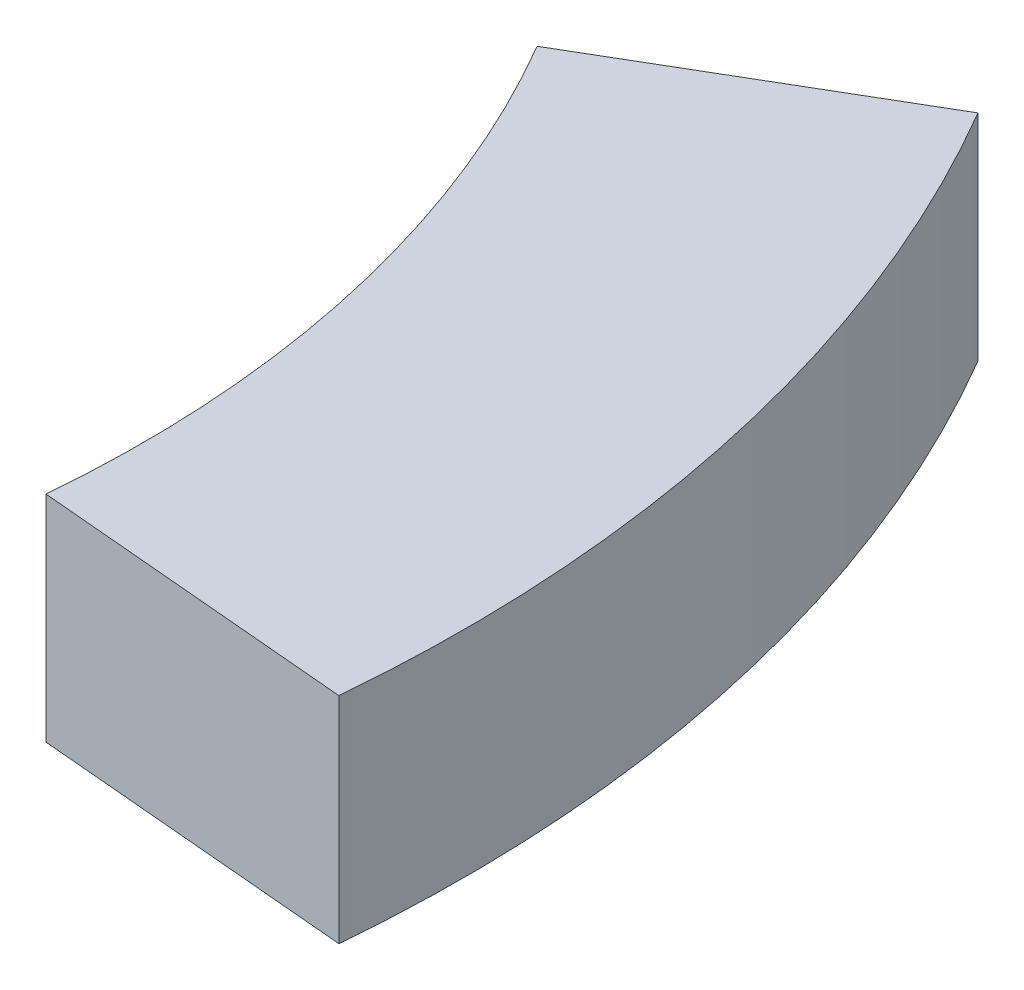
ISO-10303-21;
HEADER;
FILE_DESCRIPTION(('STEP AP214'),'2;1');
FILE_NAME('part.step','',(''),(''),'','','');
FILE_SCHEMA(('AUTOMOTIVE_DESIGN { 1 0 10303 214 1 1 1 1 }'));
ENDSEC;
DATA;
#1=APPLICATION_CONTEXT('core data for automotive mechanical design processes');
#2=APPLICATION_PROTOCOL_DEFINITION('international standard','automotive_design',2000,#1);
#3=PRODUCT_CONTEXT('',#1,'mechanical');
#4=PRODUCT('Part','Part','',(#3));
#5=PRODUCT_RELATED_PRODUCT_CATEGORY('part','',(#4));
#6=PRODUCT_DEFINITION_FORMATION('','',#4);
#7=PRODUCT_DEFINITION_CONTEXT('part definition',#1,'design');
#8=PRODUCT_DEFINITION('design','',#6,#7);
#9=PRODUCT_DEFINITION_SHAPE('','',#8);
#10=(LENGTH_UNIT() NAMED_UNIT(*) SI_UNIT(.MILLI.,.METRE.));
#11=(NAMED_UNIT(*) PLANE_ANGLE_UNIT() SI_UNIT($,.RADIAN.));
#12=(NAMED_UNIT(*) SI_UNIT($,.STERADIAN.) SOLID_ANGLE_UNIT());
#13=UNCERTAINTY_MEASURE_WITH_UNIT(LENGTH_MEASURE(1.E-05),#10,'distance_accuracy_value','');
#14=(GEOMETRIC_REPRESENTATION_CONTEXT(3) GLOBAL_UNCERTAINTY_ASSIGNED_CONTEXT((#13)) GLOBAL_UNIT_ASSIGNED_CONTEXT((#10,
#11,#12)) REPRESENTATION_CONTEXT('',''));
#15=CARTESIAN_POINT('',(0.,0.,0.));
#16=DIRECTION('',(0.,0.,1.));
#17=DIRECTION('',(1.,0.,0.));
#18=AXIS2_PLACEMENT_3D('',#15,#16,#17);
#19=CARTESIAN_POINT('',(0.,10.,0.));
#20=DIRECTION('',(0.,-1.,0.));
#21=DIRECTION('',(0.,0.,-1.));
#22=AXIS2_PLACEMENT_3D('',#19,#20,#21);
#23=CYLINDRICAL_SURFACE('',#22,49.78);
#24=CARTESIAN_POINT('',(0.,0.,0.));
#25=DIRECTION('',(0.,1.,0.));
#26=DIRECTION('',(0.,0.,1.));
#27=AXIS2_PLACEMENT_3D('',#24,#25,#26);
#28=CIRCLE('',#27,49.78);
#29=CARTESIAN_POINT('',(49.5899847087733,0.,4.34532122905028));
#30=VERTEX_POINT('',#29);
#31=CARTESIAN_POINT('',(42.9686596086753,0.,-25.1344920663577));
#32=VERTEX_POINT('',#31);
#33=EDGE_CURVE('E107',#30,#32,#28,.T.);
#34=ORIENTED_EDGE('',*,*,#33,.F.);
#35=DIRECTION('',(0.,-1.,0.));
#36=VECTOR('',#35,1.);
#37=CARTESIAN_POINT('',(49.5899847087733,10.,4.34532122905028));
#38=LINE('',#37,#36);
#39=CARTESIAN_POINT('',(49.5899847087733,10.,4.34532122905028));
#40=VERTEX_POINT('',#39);
#41=EDGE_CURVE('E11',#40,#30,#38,.T.);
#42=ORIENTED_EDGE('',*,*,#41,.F.);
#43=CARTESIAN_POINT('',(0.,10.,0.));
#44=DIRECTION('',(0.,1.,0.));
#45=DIRECTION('',(0.,0.,1.));
#46=AXIS2_PLACEMENT_3D('',#43,#44,#45);
#47=CIRCLE('',#46,49.78);
#48=CARTESIAN_POINT('',(42.9686596086753,10.,-25.1344920663577));
#49=VERTEX_POINT('',#48);
#50=EDGE_CURVE('E108',#40,#49,#47,.T.);
#51=ORIENTED_EDGE('',*,*,#50,.T.);
#52=DIRECTION('',(0.,-1.,0.));
#53=VECTOR('',#52,1.);
#54=CARTESIAN_POINT('',(42.9686596086753,10.,-25.1344920663577));
#55=LINE('',#54,#53);
#56=EDGE_CURVE('E55',#49,#32,#55,.T.);
#57=ORIENTED_EDGE('',*,*,#56,.T.);
#58=EDGE_LOOP('',(#34,#42,#51,#57));
#59=FACE_BOUND('',#58,.T.);
#60=ADVANCED_FACE('F39',(#59),#23,.F.);
#61=CARTESIAN_POINT('',(0.,10.,0.));
#62=DIRECTION('',(0.0872905027932961,0.,-0.99618289893076));
#63=DIRECTION('',(-0.99618289893076,0.,-0.0872905027932961));
#64=AXIS2_PLACEMENT_3D('',#61,#62,#63);
#65=PLANE('',#64);
#66=DIRECTION('',(0.996182898930761,0.,0.0872905027932961));
#67=VECTOR('',#66,1.);
#68=CARTESIAN_POINT('',(0.,0.,0.));
#69=LINE('',#68,#67);
#70=CARTESIAN_POINT('',(64.5327281927347,0.,5.65467877094972));
#71=VERTEX_POINT('',#70);
#72=EDGE_CURVE('E118',#30,#71,#69,.T.);
#73=ORIENTED_EDGE('',*,*,#72,.T.);
#74=DIRECTION('',(0.,-1.,0.));
#75=VECTOR('',#74,1.);
#76=CARTESIAN_POINT('',(64.5327281927347,10.,5.65467877094972));
#77=LINE('',#76,#75);
#78=CARTESIAN_POINT('',(64.5327281927347,10.,5.65467877094972));
#79=VERTEX_POINT('',#78);
#80=EDGE_CURVE('E47',#79,#71,#77,.T.);
#81=ORIENTED_EDGE('',*,*,#80,.F.);
#82=DIRECTION('',(0.996182898930761,0.,0.0872905027932961));
#83=VECTOR('',#82,1.);
#84=CARTESIAN_POINT('',(0.,10.,0.));
#85=LINE('',#84,#83);
#86=EDGE_CURVE('E110',#40,#79,#85,.T.);
#87=ORIENTED_EDGE('',*,*,#86,.F.);
#88=ORIENTED_EDGE('',*,*,#41,.T.);
#89=EDGE_LOOP('',(#73,#81,#87,#88));
#90=FACE_BOUND('',#89,.T.);
#91=ADVANCED_FACE('F145',(#90),#65,.F.);
#92=CARTESIAN_POINT('',(0.,10.,0.));
#93=DIRECTION('',(0.,-1.,0.));
#94=DIRECTION('',(0.,0.,-1.));
#95=AXIS2_PLACEMENT_3D('',#92,#93,#94);
#96=CYLINDRICAL_SURFACE('',#95,64.78);
#97=CARTESIAN_POINT('',(0.,0.,0.));
#98=DIRECTION('',(0.,1.,0.));
#99=DIRECTION('',(0.,0.,1.));
#100=AXIS2_PLACEMENT_3D('',#97,#98,#99);
#101=CIRCLE('',#100,64.78);
#102=CARTESIAN_POINT('',(55.9162267868619,0.,-32.7081638420782));
#103=VERTEX_POINT('',#102);
#104=EDGE_CURVE('E120',#71,#103,#101,.T.);
#105=ORIENTED_EDGE('',*,*,#104,.T.);
#106=DIRECTION('',(0.,-1.,0.));
#107=VECTOR('',#106,1.);
#108=CARTESIAN_POINT('',(55.9162267868619,10.,-32.7081638420782));
#109=LINE('',#108,#107);
#110=CARTESIAN_POINT('',(55.9162267868619,10.,-32.7081638420782));
#111=VERTEX_POINT('',#110);
#112=EDGE_CURVE('E70',#111,#103,#109,.T.);
#113=ORIENTED_EDGE('',*,*,#112,.F.);
#114=CARTESIAN_POINT('',(0.,10.,0.));
#115=DIRECTION('',(0.,1.,0.));
#116=DIRECTION('',(0.,0.,1.));
#117=AXIS2_PLACEMENT_3D('',#114,#115,#116);
#118=CIRCLE('',#117,64.78);
#119=EDGE_CURVE('E113',#79,#111,#118,.T.);
#120=ORIENTED_EDGE('',*,*,#119,.F.);
#121=ORIENTED_EDGE('',*,*,#80,.T.);
#122=EDGE_LOOP('',(#105,#113,#120,#121));
#123=FACE_BOUND('',#122,.T.);
#124=ADVANCED_FACE('F130',(#123),#96,.T.);
#125=CARTESIAN_POINT('',(0.,10.,0.));
#126=DIRECTION('',(-0.504911451714699,0.,-0.86317114521244));
#127=DIRECTION('',(-0.86317114521244,0.,0.504911451714699));
#128=AXIS2_PLACEMENT_3D('',#125,#126,#127);
#129=PLANE('',#128);
#130=DIRECTION('',(0.86317114521244,0.,-0.504911451714699));
#131=VECTOR('',#130,1.);
#132=CARTESIAN_POINT('',(0.,0.,0.));
#133=LINE('',#132,#131);
#134=EDGE_CURVE('E111',#32,#103,#133,.T.);
#135=ORIENTED_EDGE('',*,*,#134,.F.);
#136=ORIENTED_EDGE('',*,*,#56,.F.);
#137=DIRECTION('',(0.86317114521244,0.,-0.504911451714699));
#138=VECTOR('',#137,1.);
#139=CARTESIAN_POINT('',(0.,10.,0.));
#140=LINE('',#139,#138);
#141=EDGE_CURVE('E115',#49,#111,#140,.T.);
#142=ORIENTED_EDGE('',*,*,#141,.T.);
#143=ORIENTED_EDGE('',*,*,#112,.T.);
#144=EDGE_LOOP('',(#135,#136,#142,#143));
#145=FACE_BOUND('',#144,.T.);
#146=ADVANCED_FACE('F135',(#145),#129,.T.);
#147=CARTESIAN_POINT('',(0.,10.,0.));
#148=DIRECTION('',(0.,1.,0.));
#149=DIRECTION('',(0.,0.,1.));
#150=AXIS2_PLACEMENT_3D('',#147,#148,#149);
#151=PLANE('',#150);
#152=ORIENTED_EDGE('',*,*,#50,.F.);
#153=ORIENTED_EDGE('',*,*,#86,.T.);
#154=ORIENTED_EDGE('',*,*,#119,.T.);
#155=ORIENTED_EDGE('',*,*,#141,.F.);
#156=EDGE_LOOP('',(#152,#153,#154,#155));
#157=FACE_BOUND('',#156,.T.);
#158=ADVANCED_FACE('F137',(#157),#151,.T.);
#159=CARTESIAN_POINT('',(0.,0.,0.));
#160=DIRECTION('',(0.,1.,0.));
#161=DIRECTION('',(0.,0.,1.));
#162=AXIS2_PLACEMENT_3D('',#159,#160,#161);
#163=PLANE('',#162);
#164=CARTESIAN_POINT('',(57.28,0.,0.));
#165=DIRECTION('',(0.,-1.,0.));
#166=DIRECTION('',(0.,0.,-1.));
#167=AXIS2_PLACEMENT_3D('',#164,#165,#166);
#168=CIRCLE('',#167,2.5);
#169=CARTESIAN_POINT('',(57.28,0.,-2.5));
#170=VERTEX_POINT('',#169);
#171=EDGE_CURVE('E97',#170,#170,#168,.T.);
#172=ORIENTED_EDGE('',*,*,#171,.F.);
#173=EDGE_LOOP('',(#172));
#174=FACE_BOUND('',#173,.T.);
#175=CARTESIAN_POINT('',(51.7762281773743,0.,-24.4993999053951));
#176=DIRECTION('',(0.,-1.,0.));
#177=DIRECTION('',(0.,0.,-1.));
#178=AXIS2_PLACEMENT_3D('',#175,#176,#177);
#179=CIRCLE('',#178,2.5);
#180=CARTESIAN_POINT('',(51.7762281773743,0.,-26.9993999053951));
#181=VERTEX_POINT('',#180);
#182=EDGE_CURVE('E96',#181,#181,#179,.T.);
#183=ORIENTED_EDGE('',*,*,#182,.F.);
#184=EDGE_LOOP('',(#183));
#185=FACE_BOUND('',#184,.T.);
#186=ORIENTED_EDGE('',*,*,#33,.T.);
#187=ORIENTED_EDGE('',*,*,#134,.T.);
#188=ORIENTED_EDGE('',*,*,#104,.F.);
#189=ORIENTED_EDGE('',*,*,#72,.F.);
#190=EDGE_LOOP('',(#186,#187,#188,#189));
#191=FACE_BOUND('',#190,.T.);
#192=ADVANCED_FACE('F134',(#174,#185,#191),#163,.F.);
#193=CARTESIAN_POINT('',(51.7762281773743,6.,-24.4993999053951));
#194=DIRECTION('',(0.,-1.,0.));
#195=DIRECTION('',(0.,0.,-1.));
#196=AXIS2_PLACEMENT_3D('',#193,#194,#195);
#197=CONICAL_SURFACE('',#196,2.5,1.02974425867665);
#198=CARTESIAN_POINT('',(51.7762281773743,7.5021515475689,-24.4993999053951));
#199=VERTEX_POINT('',#198);
#200=VERTEX_LOOP('',#199);
#201=FACE_BOUND('',#200,.T.);
#202=CARTESIAN_POINT('',(51.7762281773743,6.,-24.4993999053951));
#203=DIRECTION('',(0.,-1.,0.));
#204=DIRECTION('',(0.,0.,-1.));
#205=AXIS2_PLACEMENT_3D('',#202,#203,#204);
#206=CIRCLE('',#205,2.5);
#207=CARTESIAN_POINT('',(51.7762281773743,6.,-26.9993999053951));
#208=VERTEX_POINT('',#207);
#209=EDGE_CURVE('E100',#208,#208,#206,.T.);
#210=ORIENTED_EDGE('',*,*,#209,.T.);
#211=EDGE_LOOP('',(#210));
#212=FACE_BOUND('',#211,.T.);
#213=ADVANCED_FACE('F179',(#201,#212),#197,.F.);
#214=CARTESIAN_POINT('',(51.7762281773743,0.,-24.4993999053951));
#215=DIRECTION('',(0.,-1.,0.));
#216=DIRECTION('',(0.,0.,-1.));
#217=AXIS2_PLACEMENT_3D('',#214,#215,#216);
#218=CYLINDRICAL_SURFACE('',#217,2.5);
#219=ORIENTED_EDGE('',*,*,#209,.F.);
#220=EDGE_LOOP('',(#219));
#221=FACE_BOUND('',#220,.T.);
#222=ORIENTED_EDGE('',*,*,#182,.T.);
#223=EDGE_LOOP('',(#222));
#224=FACE_BOUND('',#223,.T.);
#225=ADVANCED_FACE('F90',(#221,#224),#218,.F.);
#226=CARTESIAN_POINT('',(57.28,6.,0.));
#227=DIRECTION('',(0.,-1.,0.));
#228=DIRECTION('',(0.,0.,-1.));
#229=AXIS2_PLACEMENT_3D('',#226,#227,#228);
#230=CONICAL_SURFACE('',#229,2.5,1.02974425867665);
#231=CARTESIAN_POINT('',(57.28,7.5021515475689,0.));
#232=VERTEX_POINT('',#231);
#233=VERTEX_LOOP('',#232);
#234=FACE_BOUND('',#233,.T.);
#235=CARTESIAN_POINT('',(57.28,6.,0.));
#236=DIRECTION('',(0.,-1.,0.));
#237=DIRECTION('',(0.,0.,-1.));
#238=AXIS2_PLACEMENT_3D('',#235,#236,#237);
#239=CIRCLE('',#238,2.5);
#240=CARTESIAN_POINT('',(57.28,6.,-2.5));
#241=VERTEX_POINT('',#240);
#242=EDGE_CURVE('E94',#241,#241,#239,.T.);
#243=ORIENTED_EDGE('',*,*,#242,.T.);
#244=EDGE_LOOP('',(#243));
#245=FACE_BOUND('',#244,.T.);
#246=ADVANCED_FACE('F86',(#234,#245),#230,.F.);
#247=CARTESIAN_POINT('',(57.28,0.,0.));
#248=DIRECTION('',(0.,-1.,0.));
#249=DIRECTION('',(0.,0.,-1.));
#250=AXIS2_PLACEMENT_3D('',#247,#248,#249);
#251=CYLINDRICAL_SURFACE('',#250,2.5);
#252=ORIENTED_EDGE('',*,*,#242,.F.);
#253=EDGE_LOOP('',(#252));
#254=FACE_BOUND('',#253,.T.);
#255=ORIENTED_EDGE('',*,*,#171,.T.);
#256=EDGE_LOOP('',(#255));
#257=FACE_BOUND('',#256,.T.);
#258=ADVANCED_FACE('F89',(#254,#257),#251,.F.);
#259=CLOSED_SHELL('',(#60,#91,#124,#146,#158,#192,#213,#225,#246,#258));
#260=MANIFOLD_SOLID_BREP('B2',#259);
#261=ADVANCED_BREP_SHAPE_REPRESENTATION('',(#18,#260),#14);
#262=SHAPE_DEFINITION_REPRESENTATION(#9,#261);
ENDSEC;
END-ISO-10303-21;
